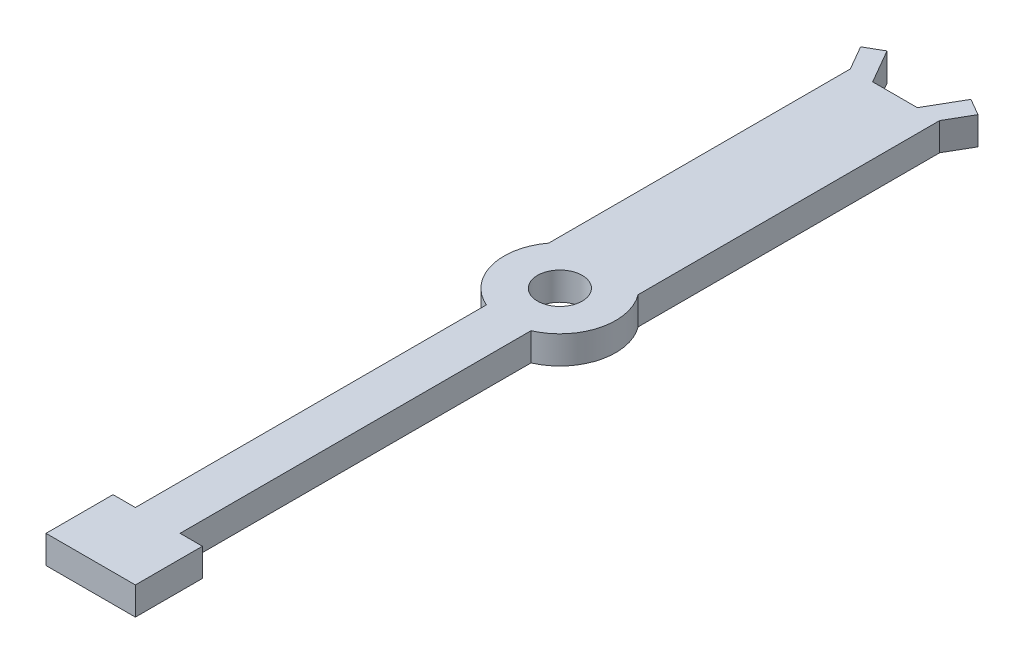
ISO-10303-21;
HEADER;
FILE_DESCRIPTION(('STEP AP214'),'2;1');
FILE_NAME('part.step','',(''),(''),'','','');
FILE_SCHEMA(('AUTOMOTIVE_DESIGN { 1 0 10303 214 1 1 1 1 }'));
ENDSEC;
DATA;
#1=APPLICATION_CONTEXT('core data for automotive mechanical design processes');
#2=APPLICATION_PROTOCOL_DEFINITION('international standard','automotive_design',2000,#1);
#3=PRODUCT_CONTEXT('',#1,'mechanical');
#4=PRODUCT('Part','Part','',(#3));
#5=PRODUCT_RELATED_PRODUCT_CATEGORY('part','',(#4));
#6=PRODUCT_DEFINITION_FORMATION('','',#4);
#7=PRODUCT_DEFINITION_CONTEXT('part definition',#1,'design');
#8=PRODUCT_DEFINITION('design','',#6,#7);
#9=PRODUCT_DEFINITION_SHAPE('','',#8);
#10=(LENGTH_UNIT() NAMED_UNIT(*) SI_UNIT(.MILLI.,.METRE.));
#11=(NAMED_UNIT(*) PLANE_ANGLE_UNIT() SI_UNIT($,.RADIAN.));
#12=(NAMED_UNIT(*) SI_UNIT($,.STERADIAN.) SOLID_ANGLE_UNIT());
#13=UNCERTAINTY_MEASURE_WITH_UNIT(LENGTH_MEASURE(1.E-05),#10,'distance_accuracy_value','');
#14=(GEOMETRIC_REPRESENTATION_CONTEXT(3) GLOBAL_UNCERTAINTY_ASSIGNED_CONTEXT((#13)) GLOBAL_UNIT_ASSIGNED_CONTEXT((#10,
#11,#12)) REPRESENTATION_CONTEXT('',''));
#15=CARTESIAN_POINT('',(0.,0.,0.));
#16=DIRECTION('',(0.,0.,1.));
#17=DIRECTION('',(1.,0.,0.));
#18=AXIS2_PLACEMENT_3D('',#15,#16,#17);
#19=CARTESIAN_POINT('',(2.,2.5,0.));
#20=DIRECTION('',(-1.,0.,0.));
#21=DIRECTION('',(0.,0.,1.));
#22=AXIS2_PLACEMENT_3D('',#19,#20,#21);
#23=PLANE('',#22);
#24=DIRECTION('',(0.,0.,-1.));
#25=VECTOR('',#24,1.);
#26=CARTESIAN_POINT('',(2.,0.,0.));
#27=LINE('',#26,#25);
#28=CARTESIAN_POINT('',(2.,0.,36.));
#29=VERTEX_POINT('',#28);
#30=CARTESIAN_POINT('',(2.,0.,4.58257569495584));
#31=VERTEX_POINT('',#30);
#32=EDGE_CURVE('E196',#29,#31,#27,.T.);
#33=ORIENTED_EDGE('',*,*,#32,.T.);
#34=DIRECTION('',(0.,-1.,0.));
#35=VECTOR('',#34,1.);
#36=CARTESIAN_POINT('',(2.,2.5,4.58257569495584));
#37=LINE('',#36,#35);
#38=CARTESIAN_POINT('',(2.,2.5,4.58257569495584));
#39=VERTEX_POINT('',#38);
#40=EDGE_CURVE('E11',#39,#31,#37,.T.);
#41=ORIENTED_EDGE('',*,*,#40,.F.);
#42=DIRECTION('',(0.,0.,-1.));
#43=VECTOR('',#42,1.);
#44=CARTESIAN_POINT('',(2.,2.5,0.));
#45=LINE('',#44,#43);
#46=CARTESIAN_POINT('',(2.,2.5,36.));
#47=VERTEX_POINT('',#46);
#48=EDGE_CURVE('E243',#47,#39,#45,.T.);
#49=ORIENTED_EDGE('',*,*,#48,.F.);
#50=DIRECTION('',(0.,-1.,0.));
#51=VECTOR('',#50,1.);
#52=CARTESIAN_POINT('',(2.,2.5,36.));
#53=LINE('',#52,#51);
#54=EDGE_CURVE('E51',#47,#29,#53,.T.);
#55=ORIENTED_EDGE('',*,*,#54,.T.);
#56=EDGE_LOOP('',(#33,#41,#49,#55));
#57=FACE_BOUND('',#56,.T.);
#58=ADVANCED_FACE('F35',(#57),#23,.F.);
#59=CARTESIAN_POINT('',(0.,2.5,0.));
#60=DIRECTION('',(0.,-1.,0.));
#61=DIRECTION('',(0.,0.,-1.));
#62=AXIS2_PLACEMENT_3D('',#59,#60,#61);
#63=CYLINDRICAL_SURFACE('',#62,5.);
#64=CARTESIAN_POINT('',(0.,0.,0.));
#65=DIRECTION('',(0.,1.,0.));
#66=DIRECTION('',(0.,0.,1.));
#67=AXIS2_PLACEMENT_3D('',#64,#65,#66);
#68=CIRCLE('',#67,5.);
#69=CARTESIAN_POINT('',(4.,0.,-3.));
#70=VERTEX_POINT('',#69);
#71=EDGE_CURVE('E198',#31,#70,#68,.T.);
#72=ORIENTED_EDGE('',*,*,#71,.T.);
#73=DIRECTION('',(0.,-1.,0.));
#74=VECTOR('',#73,1.);
#75=CARTESIAN_POINT('',(4.,2.5,-3.));
#76=LINE('',#75,#74);
#77=CARTESIAN_POINT('',(4.,2.5,-3.));
#78=VERTEX_POINT('',#77);
#79=EDGE_CURVE('E43',#78,#70,#76,.T.);
#80=ORIENTED_EDGE('',*,*,#79,.F.);
#81=CARTESIAN_POINT('',(0.,2.5,0.));
#82=DIRECTION('',(0.,1.,0.));
#83=DIRECTION('',(0.,0.,1.));
#84=AXIS2_PLACEMENT_3D('',#81,#82,#83);
#85=CIRCLE('',#84,5.);
#86=EDGE_CURVE('E119',#39,#78,#85,.T.);
#87=ORIENTED_EDGE('',*,*,#86,.F.);
#88=ORIENTED_EDGE('',*,*,#40,.T.);
#89=EDGE_LOOP('',(#72,#80,#87,#88));
#90=FACE_BOUND('',#89,.T.);
#91=ADVANCED_FACE('F346',(#90),#63,.T.);
#92=CARTESIAN_POINT('',(4.,2.5,0.));
#93=DIRECTION('',(-1.,0.,0.));
#94=DIRECTION('',(0.,0.,1.));
#95=AXIS2_PLACEMENT_3D('',#92,#93,#94);
#96=PLANE('',#95);
#97=DIRECTION('',(0.,0.,-1.));
#98=VECTOR('',#97,1.);
#99=CARTESIAN_POINT('',(4.,0.,0.));
#100=LINE('',#99,#98);
#101=CARTESIAN_POINT('',(4.,0.,-30.));
#102=VERTEX_POINT('',#101);
#103=EDGE_CURVE('E200',#70,#102,#100,.T.);
#104=ORIENTED_EDGE('',*,*,#103,.T.);
#105=DIRECTION('',(0.,-1.,0.));
#106=VECTOR('',#105,1.);
#107=CARTESIAN_POINT('',(4.,2.5,-30.));
#108=LINE('',#107,#106);
#109=CARTESIAN_POINT('',(4.,2.5,-30.));
#110=VERTEX_POINT('',#109);
#111=EDGE_CURVE('E272',#110,#102,#108,.T.);
#112=ORIENTED_EDGE('',*,*,#111,.F.);
#113=DIRECTION('',(0.,0.,-1.));
#114=VECTOR('',#113,1.);
#115=CARTESIAN_POINT('',(4.,2.5,0.));
#116=LINE('',#115,#114);
#117=EDGE_CURVE('E280',#78,#110,#116,.T.);
#118=ORIENTED_EDGE('',*,*,#117,.F.);
#119=ORIENTED_EDGE('',*,*,#79,.T.);
#120=EDGE_LOOP('',(#104,#112,#118,#119));
#121=FACE_BOUND('',#120,.T.);
#122=ADVANCED_FACE('F278',(#121),#96,.F.);
#123=CARTESIAN_POINT('',(-9.99038105676659,2.5,-5.76794919243113));
#124=DIRECTION('',(-0.866025403784438,0.,-0.5));
#125=DIRECTION('',(-0.5,0.,0.866025403784438));
#126=AXIS2_PLACEMENT_3D('',#123,#124,#125);
#127=PLANE('',#126);
#128=DIRECTION('',(0.5,0.,-0.866025403784438));
#129=VECTOR('',#128,1.);
#130=CARTESIAN_POINT('',(-9.99038105676659,0.,-5.76794919243113));
#131=LINE('',#130,#129);
#132=CARTESIAN_POINT('',(5.25505197954072,0.,-32.1738137947044));
#133=VERTEX_POINT('',#132);
#134=EDGE_CURVE('E202',#102,#133,#131,.T.);
#135=ORIENTED_EDGE('',*,*,#134,.T.);
#136=DIRECTION('',(0.,-1.,0.));
#137=VECTOR('',#136,1.);
#138=CARTESIAN_POINT('',(5.25505197954072,2.5,-32.1738137947044));
#139=LINE('',#138,#137);
#140=CARTESIAN_POINT('',(5.25505197954072,2.5,-32.1738137947044));
#141=VERTEX_POINT('',#140);
#142=EDGE_CURVE('E269',#141,#133,#139,.T.);
#143=ORIENTED_EDGE('',*,*,#142,.F.);
#144=DIRECTION('',(0.5,0.,-0.866025403784438));
#145=VECTOR('',#144,1.);
#146=CARTESIAN_POINT('',(-9.99038105676659,2.5,-5.76794919243113));
#147=LINE('',#146,#145);
#148=EDGE_CURVE('E298',#110,#141,#147,.T.);
#149=ORIENTED_EDGE('',*,*,#148,.F.);
#150=ORIENTED_EDGE('',*,*,#111,.T.);
#151=EDGE_LOOP('',(#135,#143,#149,#150));
#152=FACE_BOUND('',#151,.T.);
#153=ADVANCED_FACE('F289',(#152),#127,.F.);
#154=CARTESIAN_POINT('',(15.2454330363073,2.5,-26.4058646022733));
#155=DIRECTION('',(-0.499999999999999,0.,0.86602540378444));
#156=DIRECTION('',(0.86602540378444,0.,0.499999999999999));
#157=AXIS2_PLACEMENT_3D('',#154,#155,#156);
#158=PLANE('',#157);
#159=DIRECTION('',(-0.86602540378444,0.,-0.499999999999999));
#160=VECTOR('',#159,1.);
#161=CARTESIAN_POINT('',(15.2454330363073,0.,-26.4058646022733));
#162=LINE('',#161,#160);
#163=CARTESIAN_POINT('',(3.75505197954072,0.,-33.0398391984889));
#164=VERTEX_POINT('',#163);
#165=EDGE_CURVE('E204',#133,#164,#162,.T.);
#166=ORIENTED_EDGE('',*,*,#165,.T.);
#167=DIRECTION('',(0.,-1.,0.));
#168=VECTOR('',#167,1.);
#169=CARTESIAN_POINT('',(3.75505197954072,2.5,-33.0398391984889));
#170=LINE('',#169,#168);
#171=CARTESIAN_POINT('',(3.75505197954072,2.5,-33.0398391984889));
#172=VERTEX_POINT('',#171);
#173=EDGE_CURVE('E266',#172,#164,#170,.T.);
#174=ORIENTED_EDGE('',*,*,#173,.F.);
#175=DIRECTION('',(-0.86602540378444,0.,-0.499999999999999));
#176=VECTOR('',#175,1.);
#177=CARTESIAN_POINT('',(15.2454330363073,2.5,-26.4058646022733));
#178=LINE('',#177,#176);
#179=EDGE_CURVE('E295',#141,#172,#178,.T.);
#180=ORIENTED_EDGE('',*,*,#179,.F.);
#181=ORIENTED_EDGE('',*,*,#142,.T.);
#182=EDGE_LOOP('',(#166,#174,#180,#181));
#183=FACE_BOUND('',#182,.T.);
#184=ADVANCED_FACE('F293',(#183),#158,.F.);
#185=CARTESIAN_POINT('',(-11.4903810567666,2.5,-6.63397459621557));
#186=DIRECTION('',(0.866025403784438,0.,0.5));
#187=DIRECTION('',(0.5,0.,-0.866025403784438));
#188=AXIS2_PLACEMENT_3D('',#185,#186,#187);
#189=PLANE('',#188);
#190=DIRECTION('',(-0.5,0.,0.866025403784439));
#191=VECTOR('',#190,1.);
#192=CARTESIAN_POINT('',(-11.4903810567666,0.,-6.63397459621557));
#193=LINE('',#192,#191);
#194=CARTESIAN_POINT('',(2.00000000000001,0.,-30.));
#195=VERTEX_POINT('',#194);
#196=EDGE_CURVE('E206',#164,#195,#193,.T.);
#197=ORIENTED_EDGE('',*,*,#196,.T.);
#198=DIRECTION('',(0.,-1.,0.));
#199=VECTOR('',#198,1.);
#200=CARTESIAN_POINT('',(2.00000000000001,2.5,-30.));
#201=LINE('',#200,#199);
#202=CARTESIAN_POINT('',(2.00000000000001,2.5,-30.));
#203=VERTEX_POINT('',#202);
#204=EDGE_CURVE('E264',#203,#195,#201,.T.);
#205=ORIENTED_EDGE('',*,*,#204,.F.);
#206=DIRECTION('',(-0.5,0.,0.866025403784439));
#207=VECTOR('',#206,1.);
#208=CARTESIAN_POINT('',(-11.4903810567666,2.5,-6.63397459621557));
#209=LINE('',#208,#207);
#210=EDGE_CURVE('E297',#172,#203,#209,.T.);
#211=ORIENTED_EDGE('',*,*,#210,.F.);
#212=ORIENTED_EDGE('',*,*,#173,.T.);
#213=EDGE_LOOP('',(#197,#205,#211,#212));
#214=FACE_BOUND('',#213,.T.);
#215=ADVANCED_FACE('F362',(#214),#189,.F.);
#216=CARTESIAN_POINT('',(0.,2.5,-30.));
#217=DIRECTION('',(0.,0.,-1.));
#218=DIRECTION('',(-1.,0.,0.));
#219=AXIS2_PLACEMENT_3D('',#216,#217,#218);
#220=PLANE('',#219);
#221=DIRECTION('',(1.,0.,0.));
#222=VECTOR('',#221,1.);
#223=CARTESIAN_POINT('',(0.,0.,-30.));
#224=LINE('',#223,#222);
#225=CARTESIAN_POINT('',(-2.00000000000001,0.,-30.));
#226=VERTEX_POINT('',#225);
#227=EDGE_CURVE('E209',#226,#195,#224,.T.);
#228=ORIENTED_EDGE('',*,*,#227,.F.);
#229=DIRECTION('',(0.,-1.,0.));
#230=VECTOR('',#229,1.);
#231=CARTESIAN_POINT('',(-2.00000000000001,2.5,-30.));
#232=LINE('',#231,#230);
#233=CARTESIAN_POINT('',(-2.00000000000001,2.5,-30.));
#234=VERTEX_POINT('',#233);
#235=EDGE_CURVE('E262',#234,#226,#232,.T.);
#236=ORIENTED_EDGE('',*,*,#235,.F.);
#237=DIRECTION('',(1.,0.,0.));
#238=VECTOR('',#237,1.);
#239=CARTESIAN_POINT('',(0.,2.5,-30.));
#240=LINE('',#239,#238);
#241=EDGE_CURVE('E300',#234,#203,#240,.T.);
#242=ORIENTED_EDGE('',*,*,#241,.T.);
#243=ORIENTED_EDGE('',*,*,#204,.T.);
#244=EDGE_LOOP('',(#228,#236,#242,#243));
#245=FACE_BOUND('',#244,.T.);
#246=ADVANCED_FACE('F365',(#245),#220,.T.);
#247=CARTESIAN_POINT('',(11.4903810567666,2.5,-6.63397459621557));
#248=DIRECTION('',(0.866025403784438,0.,-0.5));
#249=DIRECTION('',(-0.5,0.,-0.866025403784438));
#250=AXIS2_PLACEMENT_3D('',#247,#248,#249);
#251=PLANE('',#250);
#252=DIRECTION('',(0.5,0.,0.866025403784439));
#253=VECTOR('',#252,1.);
#254=CARTESIAN_POINT('',(11.4903810567666,0.,-6.63397459621557));
#255=LINE('',#254,#253);
#256=CARTESIAN_POINT('',(-3.75505197954072,0.,-33.0398391984889));
#257=VERTEX_POINT('',#256);
#258=EDGE_CURVE('E212',#257,#226,#255,.T.);
#259=ORIENTED_EDGE('',*,*,#258,.F.);
#260=DIRECTION('',(0.,-1.,0.));
#261=VECTOR('',#260,1.);
#262=CARTESIAN_POINT('',(-3.75505197954072,2.5,-33.0398391984889));
#263=LINE('',#262,#261);
#264=CARTESIAN_POINT('',(-3.75505197954072,2.5,-33.0398391984889));
#265=VERTEX_POINT('',#264);
#266=EDGE_CURVE('E260',#265,#257,#263,.T.);
#267=ORIENTED_EDGE('',*,*,#266,.F.);
#268=DIRECTION('',(0.5,0.,0.866025403784439));
#269=VECTOR('',#268,1.);
#270=CARTESIAN_POINT('',(11.4903810567666,2.5,-6.63397459621557));
#271=LINE('',#270,#269);
#272=EDGE_CURVE('E307',#265,#234,#271,.T.);
#273=ORIENTED_EDGE('',*,*,#272,.T.);
#274=ORIENTED_EDGE('',*,*,#235,.T.);
#275=EDGE_LOOP('',(#259,#267,#273,#274));
#276=FACE_BOUND('',#275,.T.);
#277=ADVANCED_FACE('F369',(#276),#251,.T.);
#278=CARTESIAN_POINT('',(-15.2454330363073,2.5,-26.4058646022733));
#279=DIRECTION('',(-0.499999999999999,0.,-0.86602540378444));
#280=DIRECTION('',(-0.86602540378444,0.,0.499999999999999));
#281=AXIS2_PLACEMENT_3D('',#278,#279,#280);
#282=PLANE('',#281);
#283=DIRECTION('',(0.86602540378444,0.,-0.499999999999999));
#284=VECTOR('',#283,1.);
#285=CARTESIAN_POINT('',(-15.2454330363073,0.,-26.4058646022733));
#286=LINE('',#285,#284);
#287=CARTESIAN_POINT('',(-5.25505197954072,0.,-32.1738137947044));
#288=VERTEX_POINT('',#287);
#289=EDGE_CURVE('E215',#288,#257,#286,.T.);
#290=ORIENTED_EDGE('',*,*,#289,.F.);
#291=DIRECTION('',(0.,-1.,0.));
#292=VECTOR('',#291,1.);
#293=CARTESIAN_POINT('',(-5.25505197954072,2.5,-32.1738137947044));
#294=LINE('',#293,#292);
#295=CARTESIAN_POINT('',(-5.25505197954072,2.5,-32.1738137947044));
#296=VERTEX_POINT('',#295);
#297=EDGE_CURVE('E258',#296,#288,#294,.T.);
#298=ORIENTED_EDGE('',*,*,#297,.F.);
#299=DIRECTION('',(0.86602540378444,0.,-0.499999999999999));
#300=VECTOR('',#299,1.);
#301=CARTESIAN_POINT('',(-15.2454330363073,2.5,-26.4058646022733));
#302=LINE('',#301,#300);
#303=EDGE_CURVE('E310',#296,#265,#302,.T.);
#304=ORIENTED_EDGE('',*,*,#303,.T.);
#305=ORIENTED_EDGE('',*,*,#266,.T.);
#306=EDGE_LOOP('',(#290,#298,#304,#305));
#307=FACE_BOUND('',#306,.T.);
#308=ADVANCED_FACE('F373',(#307),#282,.T.);
#309=CARTESIAN_POINT('',(9.99038105676658,2.5,-5.76794919243112));
#310=DIRECTION('',(-0.866025403784439,0.,0.5));
#311=DIRECTION('',(0.5,0.,0.866025403784439));
#312=AXIS2_PLACEMENT_3D('',#309,#310,#311);
#313=PLANE('',#312);
#314=DIRECTION('',(-0.5,0.,-0.866025403784439));
#315=VECTOR('',#314,1.);
#316=CARTESIAN_POINT('',(9.99038105676658,0.,-5.76794919243112));
#317=LINE('',#316,#315);
#318=CARTESIAN_POINT('',(-4.,0.,-30.));
#319=VERTEX_POINT('',#318);
#320=EDGE_CURVE('E218',#319,#288,#317,.T.);
#321=ORIENTED_EDGE('',*,*,#320,.F.);
#322=DIRECTION('',(0.,-1.,0.));
#323=VECTOR('',#322,1.);
#324=CARTESIAN_POINT('',(-4.,2.5,-30.));
#325=LINE('',#324,#323);
#326=CARTESIAN_POINT('',(-4.,2.5,-30.));
#327=VERTEX_POINT('',#326);
#328=EDGE_CURVE('E256',#327,#319,#325,.T.);
#329=ORIENTED_EDGE('',*,*,#328,.F.);
#330=DIRECTION('',(-0.5,0.,-0.866025403784439));
#331=VECTOR('',#330,1.);
#332=CARTESIAN_POINT('',(9.99038105676658,2.5,-5.76794919243112));
#333=LINE('',#332,#331);
#334=EDGE_CURVE('E313',#327,#296,#333,.T.);
#335=ORIENTED_EDGE('',*,*,#334,.T.);
#336=ORIENTED_EDGE('',*,*,#297,.T.);
#337=EDGE_LOOP('',(#321,#329,#335,#336));
#338=FACE_BOUND('',#337,.T.);
#339=ADVANCED_FACE('F377',(#338),#313,.T.);
#340=CARTESIAN_POINT('',(-4.,2.5,0.));
#341=DIRECTION('',(-1.,0.,0.));
#342=DIRECTION('',(0.,0.,1.));
#343=AXIS2_PLACEMENT_3D('',#340,#341,#342);
#344=PLANE('',#343);
#345=DIRECTION('',(0.,0.,-1.));
#346=VECTOR('',#345,1.);
#347=CARTESIAN_POINT('',(-4.,0.,0.));
#348=LINE('',#347,#346);
#349=CARTESIAN_POINT('',(-4.,0.,-3.));
#350=VERTEX_POINT('',#349);
#351=EDGE_CURVE('E221',#350,#319,#348,.T.);
#352=ORIENTED_EDGE('',*,*,#351,.F.);
#353=DIRECTION('',(0.,-1.,0.));
#354=VECTOR('',#353,1.);
#355=CARTESIAN_POINT('',(-4.,2.5,-3.));
#356=LINE('',#355,#354);
#357=CARTESIAN_POINT('',(-4.,2.5,-3.));
#358=VERTEX_POINT('',#357);
#359=EDGE_CURVE('E254',#358,#350,#356,.T.);
#360=ORIENTED_EDGE('',*,*,#359,.F.);
#361=DIRECTION('',(0.,0.,-1.));
#362=VECTOR('',#361,1.);
#363=CARTESIAN_POINT('',(-4.,2.5,0.));
#364=LINE('',#363,#362);
#365=EDGE_CURVE('E316',#358,#327,#364,.T.);
#366=ORIENTED_EDGE('',*,*,#365,.T.);
#367=ORIENTED_EDGE('',*,*,#328,.T.);
#368=EDGE_LOOP('',(#352,#360,#366,#367));
#369=FACE_BOUND('',#368,.T.);
#370=ADVANCED_FACE('F381',(#369),#344,.T.);
#371=CARTESIAN_POINT('',(0.,2.5,0.));
#372=DIRECTION('',(0.,-1.,0.));
#373=DIRECTION('',(0.,0.,-1.));
#374=AXIS2_PLACEMENT_3D('',#371,#372,#373);
#375=CYLINDRICAL_SURFACE('',#374,5.);
#376=CARTESIAN_POINT('',(0.,0.,0.));
#377=DIRECTION('',(0.,1.,0.));
#378=DIRECTION('',(0.,0.,1.));
#379=AXIS2_PLACEMENT_3D('',#376,#377,#378);
#380=CIRCLE('',#379,5.);
#381=CARTESIAN_POINT('',(-2.,0.,4.58257569495584));
#382=VERTEX_POINT('',#381);
#383=EDGE_CURVE('E224',#350,#382,#380,.T.);
#384=ORIENTED_EDGE('',*,*,#383,.T.);
#385=DIRECTION('',(0.,-1.,0.));
#386=VECTOR('',#385,1.);
#387=CARTESIAN_POINT('',(-2.,2.5,4.58257569495584));
#388=LINE('',#387,#386);
#389=CARTESIAN_POINT('',(-2.,2.5,4.58257569495584));
#390=VERTEX_POINT('',#389);
#391=EDGE_CURVE('E252',#390,#382,#388,.T.);
#392=ORIENTED_EDGE('',*,*,#391,.F.);
#393=CARTESIAN_POINT('',(0.,2.5,0.));
#394=DIRECTION('',(0.,1.,0.));
#395=DIRECTION('',(0.,0.,1.));
#396=AXIS2_PLACEMENT_3D('',#393,#394,#395);
#397=CIRCLE('',#396,5.);
#398=EDGE_CURVE('E319',#358,#390,#397,.T.);
#399=ORIENTED_EDGE('',*,*,#398,.F.);
#400=ORIENTED_EDGE('',*,*,#359,.T.);
#401=EDGE_LOOP('',(#384,#392,#399,#400));
#402=FACE_BOUND('',#401,.T.);
#403=ADVANCED_FACE('F385',(#402),#375,.T.);
#404=CARTESIAN_POINT('',(-2.,2.5,0.));
#405=DIRECTION('',(-1.,0.,0.));
#406=DIRECTION('',(0.,0.,1.));
#407=AXIS2_PLACEMENT_3D('',#404,#405,#406);
#408=PLANE('',#407);
#409=DIRECTION('',(0.,0.,-1.));
#410=VECTOR('',#409,1.);
#411=CARTESIAN_POINT('',(-2.,0.,0.));
#412=LINE('',#411,#410);
#413=CARTESIAN_POINT('',(-2.,0.,36.));
#414=VERTEX_POINT('',#413);
#415=EDGE_CURVE('E227',#414,#382,#412,.T.);
#416=ORIENTED_EDGE('',*,*,#415,.F.);
#417=DIRECTION('',(0.,-1.,0.));
#418=VECTOR('',#417,1.);
#419=CARTESIAN_POINT('',(-2.,2.5,36.));
#420=LINE('',#419,#418);
#421=CARTESIAN_POINT('',(-2.,2.5,36.));
#422=VERTEX_POINT('',#421);
#423=EDGE_CURVE('E250',#422,#414,#420,.T.);
#424=ORIENTED_EDGE('',*,*,#423,.F.);
#425=DIRECTION('',(0.,0.,-1.));
#426=VECTOR('',#425,1.);
#427=CARTESIAN_POINT('',(-2.,2.5,0.));
#428=LINE('',#427,#426);
#429=EDGE_CURVE('E321',#422,#390,#428,.T.);
#430=ORIENTED_EDGE('',*,*,#429,.T.);
#431=ORIENTED_EDGE('',*,*,#391,.T.);
#432=EDGE_LOOP('',(#416,#424,#430,#431));
#433=FACE_BOUND('',#432,.T.);
#434=ADVANCED_FACE('F389',(#433),#408,.T.);
#435=CARTESIAN_POINT('',(0.,2.5,36.));
#436=DIRECTION('',(0.,0.,1.));
#437=DIRECTION('',(1.,0.,0.));
#438=AXIS2_PLACEMENT_3D('',#435,#436,#437);
#439=PLANE('',#438);
#440=DIRECTION('',(-1.,0.,0.));
#441=VECTOR('',#440,1.);
#442=CARTESIAN_POINT('',(0.,0.,36.));
#443=LINE('',#442,#441);
#444=CARTESIAN_POINT('',(-4.,0.,36.));
#445=VERTEX_POINT('',#444);
#446=EDGE_CURVE('E230',#414,#445,#443,.T.);
#447=ORIENTED_EDGE('',*,*,#446,.T.);
#448=DIRECTION('',(0.,-1.,0.));
#449=VECTOR('',#448,1.);
#450=CARTESIAN_POINT('',(-4.,2.5,36.));
#451=LINE('',#450,#449);
#452=CARTESIAN_POINT('',(-4.,2.5,36.));
#453=VERTEX_POINT('',#452);
#454=EDGE_CURVE('E247',#453,#445,#451,.T.);
#455=ORIENTED_EDGE('',*,*,#454,.F.);
#456=DIRECTION('',(-1.,0.,0.));
#457=VECTOR('',#456,1.);
#458=CARTESIAN_POINT('',(0.,2.5,36.));
#459=LINE('',#458,#457);
#460=EDGE_CURVE('E324',#422,#453,#459,.T.);
#461=ORIENTED_EDGE('',*,*,#460,.F.);
#462=ORIENTED_EDGE('',*,*,#423,.T.);
#463=EDGE_LOOP('',(#447,#455,#461,#462));
#464=FACE_BOUND('',#463,.T.);
#465=ADVANCED_FACE('F329',(#464),#439,.F.);
#466=CARTESIAN_POINT('',(-4.00000000000001,2.5,0.));
#467=DIRECTION('',(1.,0.,0.));
#468=DIRECTION('',(0.,0.,-1.));
#469=AXIS2_PLACEMENT_3D('',#466,#467,#468);
#470=PLANE('',#469);
#471=DIRECTION('',(0.,0.,1.));
#472=VECTOR('',#471,1.);
#473=CARTESIAN_POINT('',(-4.00000000000001,0.,0.));
#474=LINE('',#473,#472);
#475=CARTESIAN_POINT('',(-4.,0.,42.));
#476=VERTEX_POINT('',#475);
#477=EDGE_CURVE('E232',#445,#476,#474,.T.);
#478=ORIENTED_EDGE('',*,*,#477,.T.);
#479=DIRECTION('',(0.,-1.,0.));
#480=VECTOR('',#479,1.);
#481=CARTESIAN_POINT('',(-4.,2.5,42.));
#482=LINE('',#481,#480);
#483=CARTESIAN_POINT('',(-4.,2.5,42.));
#484=VERTEX_POINT('',#483);
#485=EDGE_CURVE('E185',#484,#476,#482,.T.);
#486=ORIENTED_EDGE('',*,*,#485,.F.);
#487=DIRECTION('',(0.,0.,1.));
#488=VECTOR('',#487,1.);
#489=CARTESIAN_POINT('',(-4.00000000000001,2.5,0.));
#490=LINE('',#489,#488);
#491=EDGE_CURVE('E173',#453,#484,#490,.T.);
#492=ORIENTED_EDGE('',*,*,#491,.F.);
#493=ORIENTED_EDGE('',*,*,#454,.T.);
#494=EDGE_LOOP('',(#478,#486,#492,#493));
#495=FACE_BOUND('',#494,.T.);
#496=ADVANCED_FACE('F333',(#495),#470,.F.);
#497=CARTESIAN_POINT('',(0.,2.5,42.));
#498=DIRECTION('',(0.,0.,-1.));
#499=DIRECTION('',(-1.,0.,0.));
#500=AXIS2_PLACEMENT_3D('',#497,#498,#499);
#501=PLANE('',#500);
#502=DIRECTION('',(1.,0.,0.));
#503=VECTOR('',#502,1.);
#504=CARTESIAN_POINT('',(0.,0.,42.));
#505=LINE('',#504,#503);
#506=CARTESIAN_POINT('',(4.,0.,42.));
#507=VERTEX_POINT('',#506);
#508=EDGE_CURVE('E182',#476,#507,#505,.T.);
#509=ORIENTED_EDGE('',*,*,#508,.T.);
#510=DIRECTION('',(0.,-1.,0.));
#511=VECTOR('',#510,1.);
#512=CARTESIAN_POINT('',(4.,2.5,42.));
#513=LINE('',#512,#511);
#514=CARTESIAN_POINT('',(4.,2.5,42.));
#515=VERTEX_POINT('',#514);
#516=EDGE_CURVE('E179',#515,#507,#513,.T.);
#517=ORIENTED_EDGE('',*,*,#516,.F.);
#518=DIRECTION('',(1.,0.,0.));
#519=VECTOR('',#518,1.);
#520=CARTESIAN_POINT('',(0.,2.5,42.));
#521=LINE('',#520,#519);
#522=EDGE_CURVE('E165',#484,#515,#521,.T.);
#523=ORIENTED_EDGE('',*,*,#522,.F.);
#524=ORIENTED_EDGE('',*,*,#485,.T.);
#525=EDGE_LOOP('',(#509,#517,#523,#524));
#526=FACE_BOUND('',#525,.T.);
#527=ADVANCED_FACE('F180',(#526),#501,.F.);
#528=CARTESIAN_POINT('',(4.00000000000001,2.5,0.));
#529=DIRECTION('',(1.,0.,0.));
#530=DIRECTION('',(0.,0.,-1.));
#531=AXIS2_PLACEMENT_3D('',#528,#529,#530);
#532=PLANE('',#531);
#533=DIRECTION('',(0.,0.,1.));
#534=VECTOR('',#533,1.);
#535=CARTESIAN_POINT('',(4.00000000000001,0.,0.));
#536=LINE('',#535,#534);
#537=CARTESIAN_POINT('',(4.,0.,36.));
#538=VERTEX_POINT('',#537);
#539=EDGE_CURVE('E235',#538,#507,#536,.T.);
#540=ORIENTED_EDGE('',*,*,#539,.F.);
#541=DIRECTION('',(0.,-1.,0.));
#542=VECTOR('',#541,1.);
#543=CARTESIAN_POINT('',(4.,2.5,36.));
#544=LINE('',#543,#542);
#545=CARTESIAN_POINT('',(4.,2.5,36.));
#546=VERTEX_POINT('',#545);
#547=EDGE_CURVE('E107',#546,#538,#544,.T.);
#548=ORIENTED_EDGE('',*,*,#547,.F.);
#549=DIRECTION('',(0.,0.,1.));
#550=VECTOR('',#549,1.);
#551=CARTESIAN_POINT('',(4.00000000000001,2.5,0.));
#552=LINE('',#551,#550);
#553=EDGE_CURVE('E171',#546,#515,#552,.T.);
#554=ORIENTED_EDGE('',*,*,#553,.T.);
#555=ORIENTED_EDGE('',*,*,#516,.T.);
#556=EDGE_LOOP('',(#540,#548,#554,#555));
#557=FACE_BOUND('',#556,.T.);
#558=ADVANCED_FACE('F187',(#557),#532,.T.);
#559=CARTESIAN_POINT('',(0.,2.5,36.));
#560=DIRECTION('',(0.,0.,-1.));
#561=DIRECTION('',(-1.,0.,0.));
#562=AXIS2_PLACEMENT_3D('',#559,#560,#561);
#563=PLANE('',#562);
#564=DIRECTION('',(1.,0.,0.));
#565=VECTOR('',#564,1.);
#566=CARTESIAN_POINT('',(0.,0.,36.));
#567=LINE('',#566,#565);
#568=EDGE_CURVE('E237',#29,#538,#567,.T.);
#569=ORIENTED_EDGE('',*,*,#568,.F.);
#570=ORIENTED_EDGE('',*,*,#54,.F.);
#571=DIRECTION('',(1.,0.,0.));
#572=VECTOR('',#571,1.);
#573=CARTESIAN_POINT('',(0.,2.5,36.));
#574=LINE('',#573,#572);
#575=EDGE_CURVE('E188',#47,#546,#574,.T.);
#576=ORIENTED_EDGE('',*,*,#575,.T.);
#577=ORIENTED_EDGE('',*,*,#547,.T.);
#578=EDGE_LOOP('',(#569,#570,#576,#577));
#579=FACE_BOUND('',#578,.T.);
#580=ADVANCED_FACE('F334',(#579),#563,.T.);
#581=CARTESIAN_POINT('',(0.,2.5,0.));
#582=DIRECTION('',(0.,-1.,0.));
#583=DIRECTION('',(0.,0.,-1.));
#584=AXIS2_PLACEMENT_3D('',#581,#582,#583);
#585=CYLINDRICAL_SURFACE('',#584,2.);
#586=CARTESIAN_POINT('',(0.,2.5,0.));
#587=DIRECTION('',(0.,1.,0.));
#588=DIRECTION('',(0.,0.,1.));
#589=AXIS2_PLACEMENT_3D('',#586,#587,#588);
#590=CIRCLE('',#589,2.);
#591=CARTESIAN_POINT('',(0.,2.5,2.));
#592=VERTEX_POINT('',#591);
#593=EDGE_CURVE('E190',#592,#592,#590,.T.);
#594=ORIENTED_EDGE('',*,*,#593,.T.);
#595=EDGE_LOOP('',(#594));
#596=FACE_BOUND('',#595,.T.);
#597=CARTESIAN_POINT('',(0.,0.,0.));
#598=DIRECTION('',(0.,1.,0.));
#599=DIRECTION('',(0.,0.,1.));
#600=AXIS2_PLACEMENT_3D('',#597,#598,#599);
#601=CIRCLE('',#600,2.);
#602=CARTESIAN_POINT('',(0.,0.,2.));
#603=VERTEX_POINT('',#602);
#604=EDGE_CURVE('E240',#603,#603,#601,.T.);
#605=ORIENTED_EDGE('',*,*,#604,.F.);
#606=EDGE_LOOP('',(#605));
#607=FACE_BOUND('',#606,.T.);
#608=ADVANCED_FACE('F336',(#596,#607),#585,.F.);
#609=CARTESIAN_POINT('',(0.,2.5,0.));
#610=DIRECTION('',(0.,1.,0.));
#611=DIRECTION('',(0.,0.,1.));
#612=AXIS2_PLACEMENT_3D('',#609,#610,#611);
#613=PLANE('',#612);
#614=ORIENTED_EDGE('',*,*,#48,.T.);
#615=ORIENTED_EDGE('',*,*,#86,.T.);
#616=ORIENTED_EDGE('',*,*,#117,.T.);
#617=ORIENTED_EDGE('',*,*,#148,.T.);
#618=ORIENTED_EDGE('',*,*,#179,.T.);
#619=ORIENTED_EDGE('',*,*,#210,.T.);
#620=ORIENTED_EDGE('',*,*,#241,.F.);
#621=ORIENTED_EDGE('',*,*,#272,.F.);
#622=ORIENTED_EDGE('',*,*,#303,.F.);
#623=ORIENTED_EDGE('',*,*,#334,.F.);
#624=ORIENTED_EDGE('',*,*,#365,.F.);
#625=ORIENTED_EDGE('',*,*,#398,.T.);
#626=ORIENTED_EDGE('',*,*,#429,.F.);
#627=ORIENTED_EDGE('',*,*,#460,.T.);
#628=ORIENTED_EDGE('',*,*,#491,.T.);
#629=ORIENTED_EDGE('',*,*,#522,.T.);
#630=ORIENTED_EDGE('',*,*,#553,.F.);
#631=ORIENTED_EDGE('',*,*,#575,.F.);
#632=EDGE_LOOP('',(#614,#615,#616,#617,#618,#619,#620,#621,#622,#623,#624,#625,#626,#627,#628,
#629,#630,#631));
#633=FACE_BOUND('',#632,.T.);
#634=ORIENTED_EDGE('',*,*,#593,.F.);
#635=EDGE_LOOP('',(#634));
#636=FACE_BOUND('',#635,.T.);
#637=ADVANCED_FACE('F167',(#633,#636),#613,.T.);
#638=CARTESIAN_POINT('',(0.,0.,0.));
#639=DIRECTION('',(0.,1.,0.));
#640=DIRECTION('',(0.,0.,1.));
#641=AXIS2_PLACEMENT_3D('',#638,#639,#640);
#642=PLANE('',#641);
#643=ORIENTED_EDGE('',*,*,#32,.F.);
#644=ORIENTED_EDGE('',*,*,#568,.T.);
#645=ORIENTED_EDGE('',*,*,#539,.T.);
#646=ORIENTED_EDGE('',*,*,#508,.F.);
#647=ORIENTED_EDGE('',*,*,#477,.F.);
#648=ORIENTED_EDGE('',*,*,#446,.F.);
#649=ORIENTED_EDGE('',*,*,#415,.T.);
#650=ORIENTED_EDGE('',*,*,#383,.F.);
#651=ORIENTED_EDGE('',*,*,#351,.T.);
#652=ORIENTED_EDGE('',*,*,#320,.T.);
#653=ORIENTED_EDGE('',*,*,#289,.T.);
#654=ORIENTED_EDGE('',*,*,#258,.T.);
#655=ORIENTED_EDGE('',*,*,#227,.T.);
#656=ORIENTED_EDGE('',*,*,#196,.F.);
#657=ORIENTED_EDGE('',*,*,#165,.F.);
#658=ORIENTED_EDGE('',*,*,#134,.F.);
#659=ORIENTED_EDGE('',*,*,#103,.F.);
#660=ORIENTED_EDGE('',*,*,#71,.F.);
#661=EDGE_LOOP('',(#643,#644,#645,#646,#647,#648,#649,#650,#651,#652,#653,#654,#655,#656,#657,
#658,#659,#660));
#662=FACE_BOUND('',#661,.T.);
#663=ORIENTED_EDGE('',*,*,#604,.T.);
#664=EDGE_LOOP('',(#663));
#665=FACE_BOUND('',#664,.T.);
#666=ADVANCED_FACE('F283',(#662,#665),#642,.F.);
#667=CLOSED_SHELL('',(#58,#91,#122,#153,#184,#215,#246,#277,#308,#339,#370,#403,#434,#465,#496,
#527,#558,#580,#608,#637,#666));
#668=MANIFOLD_SOLID_BREP('B2',#667);
#669=ADVANCED_BREP_SHAPE_REPRESENTATION('',(#18,#668),#14);
#670=SHAPE_DEFINITION_REPRESENTATION(#9,#669);
ENDSEC;
END-ISO-10303-21;
